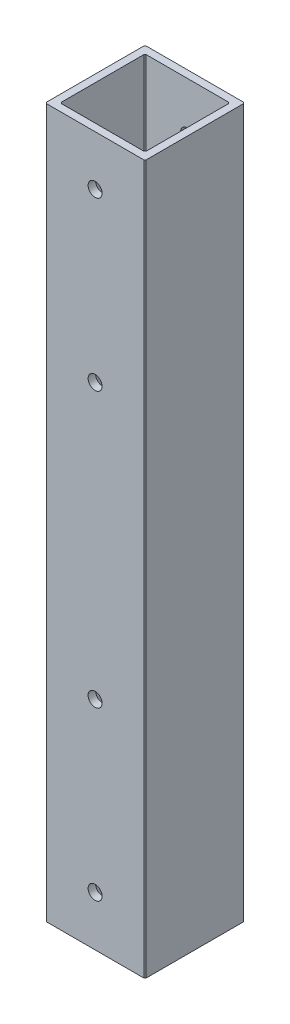
ISO-10303-21;
HEADER;
FILE_DESCRIPTION(('STEP AP214'),'2;1');
FILE_NAME('part.step','',(''),(''),'','','');
FILE_SCHEMA(('AUTOMOTIVE_DESIGN { 1 0 10303 214 1 1 1 1 }'));
ENDSEC;
DATA;
#1=APPLICATION_CONTEXT('core data for automotive mechanical design processes');
#2=APPLICATION_PROTOCOL_DEFINITION('international standard','automotive_design',2000,#1);
#3=PRODUCT_CONTEXT('',#1,'mechanical');
#4=PRODUCT('Part','Part','',(#3));
#5=PRODUCT_RELATED_PRODUCT_CATEGORY('part','',(#4));
#6=PRODUCT_DEFINITION_FORMATION('','',#4);
#7=PRODUCT_DEFINITION_CONTEXT('part definition',#1,'design');
#8=PRODUCT_DEFINITION('design','',#6,#7);
#9=PRODUCT_DEFINITION_SHAPE('','',#8);
#10=(LENGTH_UNIT() NAMED_UNIT(*) SI_UNIT(.MILLI.,.METRE.));
#11=(NAMED_UNIT(*) PLANE_ANGLE_UNIT() SI_UNIT($,.RADIAN.));
#12=(NAMED_UNIT(*) SI_UNIT($,.STERADIAN.) SOLID_ANGLE_UNIT());
#13=UNCERTAINTY_MEASURE_WITH_UNIT(LENGTH_MEASURE(1.E-05),#10,'distance_accuracy_value','');
#14=(GEOMETRIC_REPRESENTATION_CONTEXT(3) GLOBAL_UNCERTAINTY_ASSIGNED_CONTEXT((#13)) GLOBAL_UNIT_ASSIGNED_CONTEXT((#10,
#11,#12)) REPRESENTATION_CONTEXT('',''));
#15=CARTESIAN_POINT('',(0.,0.,0.));
#16=DIRECTION('',(0.,0.,1.));
#17=DIRECTION('',(1.,0.,0.));
#18=AXIS2_PLACEMENT_3D('',#15,#16,#17);
#19=CARTESIAN_POINT('',(-100.,122.,138.));
#20=DIRECTION('',(0.,0.,1.));
#21=DIRECTION('',(1.,0.,0.));
#22=AXIS2_PLACEMENT_3D('',#19,#20,#21);
#23=CYLINDRICAL_SURFACE('',#22,2.8);
#24=DIRECTION('',(0.,0.,1.));
#25=VECTOR('',#24,1.);
#26=CARTESIAN_POINT('',(-97.2,122.,138.));
#27=LINE('',#26,#25);
#28=CARTESIAN_POINT('',(-97.2,122.,177.));
#29=VERTEX_POINT('',#28);
#30=CARTESIAN_POINT('',(-97.2,122.,180.));
#31=VERTEX_POINT('',#30);
#32=EDGE_CURVE('E12',#29,#31,#27,.T.);
#33=ORIENTED_EDGE('',*,*,#32,.F.);
#34=CARTESIAN_POINT('',(-100.,122.,177.));
#35=DIRECTION('',(0.,0.,1.));
#36=DIRECTION('',(1.,0.,0.));
#37=AXIS2_PLACEMENT_3D('',#34,#35,#36);
#38=CIRCLE('',#37,2.8);
#39=EDGE_CURVE('E247',#29,#29,#38,.T.);
#40=ORIENTED_EDGE('',*,*,#39,.F.);
#41=ORIENTED_EDGE('',*,*,#32,.T.);
#42=CARTESIAN_POINT('',(-100.,122.,180.));
#43=DIRECTION('',(0.,0.,1.));
#44=DIRECTION('',(1.,0.,0.));
#45=AXIS2_PLACEMENT_3D('',#42,#43,#44);
#46=CIRCLE('',#45,2.8);
#47=EDGE_CURVE('E473',#31,#31,#46,.T.);
#48=ORIENTED_EDGE('',*,*,#47,.T.);
#49=EDGE_LOOP('',(#33,#40,#41,#48));
#50=FACE_BOUND('',#49,.T.);
#51=ADVANCED_FACE('F20',(#50),#23,.F.);
#52=CARTESIAN_POINT('',(-100.,55.,138.));
#53=DIRECTION('',(0.,0.,1.));
#54=DIRECTION('',(1.,0.,0.));
#55=AXIS2_PLACEMENT_3D('',#52,#53,#54);
#56=CYLINDRICAL_SURFACE('',#55,2.8);
#57=DIRECTION('',(0.,0.,1.));
#58=VECTOR('',#57,1.);
#59=CARTESIAN_POINT('',(-97.2,55.,138.));
#60=LINE('',#59,#58);
#61=CARTESIAN_POINT('',(-97.2,55.,177.));
#62=VERTEX_POINT('',#61);
#63=CARTESIAN_POINT('',(-97.2,55.,180.));
#64=VERTEX_POINT('',#63);
#65=EDGE_CURVE('E29',#62,#64,#60,.T.);
#66=ORIENTED_EDGE('',*,*,#65,.F.);
#67=CARTESIAN_POINT('',(-100.,55.,177.));
#68=DIRECTION('',(0.,0.,1.));
#69=DIRECTION('',(1.,0.,0.));
#70=AXIS2_PLACEMENT_3D('',#67,#68,#69);
#71=CIRCLE('',#70,2.8);
#72=EDGE_CURVE('E239',#62,#62,#71,.T.);
#73=ORIENTED_EDGE('',*,*,#72,.F.);
#74=ORIENTED_EDGE('',*,*,#65,.T.);
#75=CARTESIAN_POINT('',(-100.,55.,180.));
#76=DIRECTION('',(0.,0.,1.));
#77=DIRECTION('',(1.,0.,0.));
#78=AXIS2_PLACEMENT_3D('',#75,#76,#77);
#79=CIRCLE('',#78,2.8);
#80=EDGE_CURVE('E299',#64,#64,#79,.T.);
#81=ORIENTED_EDGE('',*,*,#80,.T.);
#82=EDGE_LOOP('',(#66,#73,#74,#81));
#83=FACE_BOUND('',#82,.T.);
#84=ADVANCED_FACE('F297',(#83),#56,.F.);
#85=CARTESIAN_POINT('',(-100.,-55.,138.));
#86=DIRECTION('',(0.,0.,1.));
#87=DIRECTION('',(1.,0.,0.));
#88=AXIS2_PLACEMENT_3D('',#85,#86,#87);
#89=CYLINDRICAL_SURFACE('',#88,2.8);
#90=DIRECTION('',(0.,0.,1.));
#91=VECTOR('',#90,1.);
#92=CARTESIAN_POINT('',(-97.2,-55.,138.));
#93=LINE('',#92,#91);
#94=CARTESIAN_POINT('',(-97.2,-55.,177.));
#95=VERTEX_POINT('',#94);
#96=CARTESIAN_POINT('',(-97.2,-55.,180.));
#97=VERTEX_POINT('',#96);
#98=EDGE_CURVE('E226',#95,#97,#93,.T.);
#99=ORIENTED_EDGE('',*,*,#98,.F.);
#100=CARTESIAN_POINT('',(-100.,-55.,177.));
#101=DIRECTION('',(0.,0.,1.));
#102=DIRECTION('',(1.,0.,0.));
#103=AXIS2_PLACEMENT_3D('',#100,#101,#102);
#104=CIRCLE('',#103,2.8);
#105=EDGE_CURVE('E229',#95,#95,#104,.T.);
#106=ORIENTED_EDGE('',*,*,#105,.F.);
#107=ORIENTED_EDGE('',*,*,#98,.T.);
#108=CARTESIAN_POINT('',(-100.,-55.,180.));
#109=DIRECTION('',(0.,0.,1.));
#110=DIRECTION('',(1.,0.,0.));
#111=AXIS2_PLACEMENT_3D('',#108,#109,#110);
#112=CIRCLE('',#111,2.8);
#113=EDGE_CURVE('E231',#97,#97,#112,.T.);
#114=ORIENTED_EDGE('',*,*,#113,.T.);
#115=EDGE_LOOP('',(#99,#106,#107,#114));
#116=FACE_BOUND('',#115,.T.);
#117=ADVANCED_FACE('F228',(#116),#89,.F.);
#118=CARTESIAN_POINT('',(-100.,-122.,138.));
#119=DIRECTION('',(0.,0.,1.));
#120=DIRECTION('',(1.,0.,0.));
#121=AXIS2_PLACEMENT_3D('',#118,#119,#120);
#122=CYLINDRICAL_SURFACE('',#121,2.8);
#123=DIRECTION('',(0.,0.,1.));
#124=VECTOR('',#123,1.);
#125=CARTESIAN_POINT('',(-97.2,-122.,138.));
#126=LINE('',#125,#124);
#127=CARTESIAN_POINT('',(-97.2,-122.,177.));
#128=VERTEX_POINT('',#127);
#129=CARTESIAN_POINT('',(-97.2,-122.,180.));
#130=VERTEX_POINT('',#129);
#131=EDGE_CURVE('E233',#128,#130,#126,.T.);
#132=ORIENTED_EDGE('',*,*,#131,.F.);
#133=CARTESIAN_POINT('',(-100.,-122.,177.));
#134=DIRECTION('',(0.,0.,1.));
#135=DIRECTION('',(1.,0.,0.));
#136=AXIS2_PLACEMENT_3D('',#133,#134,#135);
#137=CIRCLE('',#136,2.8);
#138=EDGE_CURVE('E240',#128,#128,#137,.T.);
#139=ORIENTED_EDGE('',*,*,#138,.F.);
#140=ORIENTED_EDGE('',*,*,#131,.T.);
#141=CARTESIAN_POINT('',(-100.,-122.,180.));
#142=DIRECTION('',(0.,0.,1.));
#143=DIRECTION('',(1.,0.,0.));
#144=AXIS2_PLACEMENT_3D('',#141,#142,#143);
#145=CIRCLE('',#144,2.8);
#146=EDGE_CURVE('E408',#130,#130,#145,.T.);
#147=ORIENTED_EDGE('',*,*,#146,.T.);
#148=EDGE_LOOP('',(#132,#139,#140,#147));
#149=FACE_BOUND('',#148,.T.);
#150=ADVANCED_FACE('F325',(#149),#122,.F.);
#151=CARTESIAN_POINT('',(-100.,122.,138.));
#152=DIRECTION('',(0.,0.,1.));
#153=DIRECTION('',(1.,0.,0.));
#154=AXIS2_PLACEMENT_3D('',#151,#152,#153);
#155=CYLINDRICAL_SURFACE('',#154,2.8);
#156=DIRECTION('',(0.,0.,1.));
#157=VECTOR('',#156,1.);
#158=CARTESIAN_POINT('',(-97.2,122.,138.));
#159=LINE('',#158,#157);
#160=CARTESIAN_POINT('',(-97.2,122.,140.));
#161=VERTEX_POINT('',#160);
#162=CARTESIAN_POINT('',(-97.2,122.,143.));
#163=VERTEX_POINT('',#162);
#164=EDGE_CURVE('E355',#161,#163,#159,.T.);
#165=ORIENTED_EDGE('',*,*,#164,.F.);
#166=CARTESIAN_POINT('',(-100.,122.,140.));
#167=DIRECTION('',(0.,0.,1.));
#168=DIRECTION('',(1.,0.,0.));
#169=AXIS2_PLACEMENT_3D('',#166,#167,#168);
#170=CIRCLE('',#169,2.8);
#171=EDGE_CURVE('E362',#161,#161,#170,.T.);
#172=ORIENTED_EDGE('',*,*,#171,.F.);
#173=ORIENTED_EDGE('',*,*,#164,.T.);
#174=CARTESIAN_POINT('',(-100.,122.,143.));
#175=DIRECTION('',(0.,0.,1.));
#176=DIRECTION('',(1.,0.,0.));
#177=AXIS2_PLACEMENT_3D('',#174,#175,#176);
#178=CIRCLE('',#177,2.8);
#179=EDGE_CURVE('E582',#163,#163,#178,.T.);
#180=ORIENTED_EDGE('',*,*,#179,.T.);
#181=EDGE_LOOP('',(#165,#172,#173,#180));
#182=FACE_BOUND('',#181,.T.);
#183=ADVANCED_FACE('F330',(#182),#155,.F.);
#184=CARTESIAN_POINT('',(-100.,55.,138.));
#185=DIRECTION('',(0.,0.,1.));
#186=DIRECTION('',(1.,0.,0.));
#187=AXIS2_PLACEMENT_3D('',#184,#185,#186);
#188=CYLINDRICAL_SURFACE('',#187,2.8);
#189=DIRECTION('',(0.,0.,1.));
#190=VECTOR('',#189,1.);
#191=CARTESIAN_POINT('',(-97.2,55.,138.));
#192=LINE('',#191,#190);
#193=CARTESIAN_POINT('',(-97.2,55.,140.));
#194=VERTEX_POINT('',#193);
#195=CARTESIAN_POINT('',(-97.2,55.,143.));
#196=VERTEX_POINT('',#195);
#197=EDGE_CURVE('E349',#194,#196,#192,.T.);
#198=ORIENTED_EDGE('',*,*,#197,.F.);
#199=CARTESIAN_POINT('',(-100.,55.,140.));
#200=DIRECTION('',(0.,0.,1.));
#201=DIRECTION('',(1.,0.,0.));
#202=AXIS2_PLACEMENT_3D('',#199,#200,#201);
#203=CIRCLE('',#202,2.8);
#204=EDGE_CURVE('E351',#194,#194,#203,.T.);
#205=ORIENTED_EDGE('',*,*,#204,.F.);
#206=ORIENTED_EDGE('',*,*,#197,.T.);
#207=CARTESIAN_POINT('',(-100.,55.,143.));
#208=DIRECTION('',(0.,0.,1.));
#209=DIRECTION('',(1.,0.,0.));
#210=AXIS2_PLACEMENT_3D('',#207,#208,#209);
#211=CIRCLE('',#210,2.8);
#212=EDGE_CURVE('E353',#196,#196,#211,.T.);
#213=ORIENTED_EDGE('',*,*,#212,.T.);
#214=EDGE_LOOP('',(#198,#205,#206,#213));
#215=FACE_BOUND('',#214,.T.);
#216=ADVANCED_FACE('F334',(#215),#188,.F.);
#217=CARTESIAN_POINT('',(-100.,-55.,138.));
#218=DIRECTION('',(0.,0.,1.));
#219=DIRECTION('',(1.,0.,0.));
#220=AXIS2_PLACEMENT_3D('',#217,#218,#219);
#221=CYLINDRICAL_SURFACE('',#220,2.8);
#222=DIRECTION('',(0.,0.,1.));
#223=VECTOR('',#222,1.);
#224=CARTESIAN_POINT('',(-97.2,-55.,138.));
#225=LINE('',#224,#223);
#226=CARTESIAN_POINT('',(-97.2,-55.,140.));
#227=VERTEX_POINT('',#226);
#228=CARTESIAN_POINT('',(-97.2,-55.,143.));
#229=VERTEX_POINT('',#228);
#230=EDGE_CURVE('E356',#227,#229,#225,.T.);
#231=ORIENTED_EDGE('',*,*,#230,.F.);
#232=CARTESIAN_POINT('',(-100.,-55.,140.));
#233=DIRECTION('',(0.,0.,1.));
#234=DIRECTION('',(1.,0.,0.));
#235=AXIS2_PLACEMENT_3D('',#232,#233,#234);
#236=CIRCLE('',#235,2.8);
#237=EDGE_CURVE('E363',#227,#227,#236,.T.);
#238=ORIENTED_EDGE('',*,*,#237,.F.);
#239=ORIENTED_EDGE('',*,*,#230,.T.);
#240=CARTESIAN_POINT('',(-100.,-55.,143.));
#241=DIRECTION('',(0.,0.,1.));
#242=DIRECTION('',(1.,0.,0.));
#243=AXIS2_PLACEMENT_3D('',#240,#241,#242);
#244=CIRCLE('',#243,2.8);
#245=EDGE_CURVE('E257',#229,#229,#244,.T.);
#246=ORIENTED_EDGE('',*,*,#245,.T.);
#247=EDGE_LOOP('',(#231,#238,#239,#246));
#248=FACE_BOUND('',#247,.T.);
#249=ADVANCED_FACE('F336',(#248),#221,.F.);
#250=CARTESIAN_POINT('',(-100.,-122.,138.));
#251=DIRECTION('',(0.,0.,1.));
#252=DIRECTION('',(1.,0.,0.));
#253=AXIS2_PLACEMENT_3D('',#250,#251,#252);
#254=CYLINDRICAL_SURFACE('',#253,2.8);
#255=DIRECTION('',(0.,0.,1.));
#256=VECTOR('',#255,1.);
#257=CARTESIAN_POINT('',(-97.2,-122.,138.));
#258=LINE('',#257,#256);
#259=CARTESIAN_POINT('',(-97.2,-122.,140.));
#260=VERTEX_POINT('',#259);
#261=CARTESIAN_POINT('',(-97.2,-122.,143.));
#262=VERTEX_POINT('',#261);
#263=EDGE_CURVE('E290',#260,#262,#258,.T.);
#264=ORIENTED_EDGE('',*,*,#263,.F.);
#265=CARTESIAN_POINT('',(-100.,-122.,140.));
#266=DIRECTION('',(0.,0.,1.));
#267=DIRECTION('',(1.,0.,0.));
#268=AXIS2_PLACEMENT_3D('',#265,#266,#267);
#269=CIRCLE('',#268,2.8);
#270=EDGE_CURVE('E372',#260,#260,#269,.T.);
#271=ORIENTED_EDGE('',*,*,#270,.F.);
#272=ORIENTED_EDGE('',*,*,#263,.T.);
#273=CARTESIAN_POINT('',(-100.,-122.,143.));
#274=DIRECTION('',(0.,0.,1.));
#275=DIRECTION('',(1.,0.,0.));
#276=AXIS2_PLACEMENT_3D('',#273,#274,#275);
#277=CIRCLE('',#276,2.8);
#278=EDGE_CURVE('E389',#262,#262,#277,.T.);
#279=ORIENTED_EDGE('',*,*,#278,.T.);
#280=EDGE_LOOP('',(#264,#271,#272,#279));
#281=FACE_BOUND('',#280,.T.);
#282=ADVANCED_FACE('F314',(#281),#254,.F.);
#283=CARTESIAN_POINT('',(-80.,142.,140.));
#284=DIRECTION('',(0.,1.,0.));
#285=DIRECTION('',(1.,0.,0.));
#286=AXIS2_PLACEMENT_3D('',#283,#284,#285);
#287=PLANE('',#286);
#288=DIRECTION('',(1.,0.,0.));
#289=VECTOR('',#288,1.);
#290=CARTESIAN_POINT('',(-81.5,142.,143.));
#291=LINE('',#290,#289);
#292=CARTESIAN_POINT('',(-116.5,142.,143.));
#293=VERTEX_POINT('',#292);
#294=CARTESIAN_POINT('',(-83.5,142.,143.));
#295=VERTEX_POINT('',#294);
#296=EDGE_CURVE('E507',#293,#295,#291,.T.);
#297=ORIENTED_EDGE('',*,*,#296,.T.);
#298=DIRECTION('',(0.707106781186548,0.,0.707106781186548));
#299=VECTOR('',#298,1.);
#300=CARTESIAN_POINT('',(-83.25,142.,143.25));
#301=LINE('',#300,#299);
#302=CARTESIAN_POINT('',(-83.,142.,143.5));
#303=VERTEX_POINT('',#302);
#304=EDGE_CURVE('E270',#295,#303,#301,.T.);
#305=ORIENTED_EDGE('',*,*,#304,.T.);
#306=DIRECTION('',(0.,0.,1.));
#307=VECTOR('',#306,1.);
#308=CARTESIAN_POINT('',(-83.,142.,141.5));
#309=LINE('',#308,#307);
#310=CARTESIAN_POINT('',(-83.,142.,176.5));
#311=VERTEX_POINT('',#310);
#312=EDGE_CURVE('E416',#303,#311,#309,.T.);
#313=ORIENTED_EDGE('',*,*,#312,.T.);
#314=DIRECTION('',(0.707106781186548,0.,-0.707106781186548));
#315=VECTOR('',#314,1.);
#316=CARTESIAN_POINT('',(-73.25,142.,166.75));
#317=LINE('',#316,#315);
#318=CARTESIAN_POINT('',(-83.5,142.,177.));
#319=VERTEX_POINT('',#318);
#320=EDGE_CURVE('E283',#319,#311,#317,.T.);
#321=ORIENTED_EDGE('',*,*,#320,.F.);
#322=DIRECTION('',(1.,0.,0.));
#323=VECTOR('',#322,1.);
#324=CARTESIAN_POINT('',(-81.5,142.,177.));
#325=LINE('',#324,#323);
#326=CARTESIAN_POINT('',(-116.5,142.,177.));
#327=VERTEX_POINT('',#326);
#328=EDGE_CURVE('E250',#327,#319,#325,.T.);
#329=ORIENTED_EDGE('',*,*,#328,.F.);
#330=DIRECTION('',(0.707106781186548,0.,0.707106781186548));
#331=VECTOR('',#330,1.);
#332=CARTESIAN_POINT('',(-116.75,142.,176.75));
#333=LINE('',#332,#331);
#334=CARTESIAN_POINT('',(-117.,142.,176.5));
#335=VERTEX_POINT('',#334);
#336=EDGE_CURVE('E272',#335,#327,#333,.T.);
#337=ORIENTED_EDGE('',*,*,#336,.F.);
#338=DIRECTION('',(0.,0.,1.));
#339=VECTOR('',#338,1.);
#340=CARTESIAN_POINT('',(-117.,142.,141.5));
#341=LINE('',#340,#339);
#342=CARTESIAN_POINT('',(-117.,142.,143.5));
#343=VERTEX_POINT('',#342);
#344=EDGE_CURVE('E421',#343,#335,#341,.T.);
#345=ORIENTED_EDGE('',*,*,#344,.F.);
#346=DIRECTION('',(-0.707106781186548,0.,0.707106781186548));
#347=VECTOR('',#346,1.);
#348=CARTESIAN_POINT('',(-106.75,142.,133.25));
#349=LINE('',#348,#347);
#350=EDGE_CURVE('E504',#293,#343,#349,.T.);
#351=ORIENTED_EDGE('',*,*,#350,.F.);
#352=EDGE_LOOP('',(#297,#305,#313,#321,#329,#337,#345,#351));
#353=FACE_BOUND('',#352,.T.);
#354=DIRECTION('',(0.,0.,1.));
#355=VECTOR('',#354,1.);
#356=CARTESIAN_POINT('',(-80.,142.,140.));
#357=LINE('',#356,#355);
#358=CARTESIAN_POINT('',(-80.,142.,140.5));
#359=VERTEX_POINT('',#358);
#360=CARTESIAN_POINT('',(-80.,142.,179.5));
#361=VERTEX_POINT('',#360);
#362=EDGE_CURVE('E442',#359,#361,#357,.T.);
#363=ORIENTED_EDGE('',*,*,#362,.F.);
#364=DIRECTION('',(-0.707106781186548,0.,-0.707106781186548));
#365=VECTOR('',#364,1.);
#366=CARTESIAN_POINT('',(-80.25,142.,140.25));
#367=LINE('',#366,#365);
#368=CARTESIAN_POINT('',(-80.5,142.,140.));
#369=VERTEX_POINT('',#368);
#370=EDGE_CURVE('E452',#359,#369,#367,.T.);
#371=ORIENTED_EDGE('',*,*,#370,.T.);
#372=DIRECTION('',(-1.,0.,0.));
#373=VECTOR('',#372,1.);
#374=CARTESIAN_POINT('',(-80.,142.,140.));
#375=LINE('',#374,#373);
#376=CARTESIAN_POINT('',(-119.5,142.,140.));
#377=VERTEX_POINT('',#376);
#378=EDGE_CURVE('E402',#369,#377,#375,.T.);
#379=ORIENTED_EDGE('',*,*,#378,.T.);
#380=DIRECTION('',(-0.707106781186548,0.,0.707106781186548));
#381=VECTOR('',#380,1.);
#382=CARTESIAN_POINT('',(-109.75,142.,130.25));
#383=LINE('',#382,#381);
#384=CARTESIAN_POINT('',(-120.,142.,140.5));
#385=VERTEX_POINT('',#384);
#386=EDGE_CURVE('E481',#377,#385,#383,.T.);
#387=ORIENTED_EDGE('',*,*,#386,.T.);
#388=DIRECTION('',(0.,0.,1.));
#389=VECTOR('',#388,1.);
#390=CARTESIAN_POINT('',(-120.,142.,140.));
#391=LINE('',#390,#389);
#392=CARTESIAN_POINT('',(-120.,142.,179.5));
#393=VERTEX_POINT('',#392);
#394=EDGE_CURVE('E498',#385,#393,#391,.T.);
#395=ORIENTED_EDGE('',*,*,#394,.T.);
#396=DIRECTION('',(-0.707106781186548,0.,-0.707106781186548));
#397=VECTOR('',#396,1.);
#398=CARTESIAN_POINT('',(-119.75,142.,179.75));
#399=LINE('',#398,#397);
#400=CARTESIAN_POINT('',(-119.5,142.,180.));
#401=VERTEX_POINT('',#400);
#402=EDGE_CURVE('E485',#401,#393,#399,.T.);
#403=ORIENTED_EDGE('',*,*,#402,.F.);
#404=DIRECTION('',(-1.,0.,0.));
#405=VECTOR('',#404,1.);
#406=CARTESIAN_POINT('',(-80.,142.,180.));
#407=LINE('',#406,#405);
#408=CARTESIAN_POINT('',(-80.5,142.,180.));
#409=VERTEX_POINT('',#408);
#410=EDGE_CURVE('E369',#409,#401,#407,.T.);
#411=ORIENTED_EDGE('',*,*,#410,.F.);
#412=DIRECTION('',(-0.707106781186548,0.,0.707106781186548));
#413=VECTOR('',#412,1.);
#414=CARTESIAN_POINT('',(-70.25,142.,169.75));
#415=LINE('',#414,#413);
#416=EDGE_CURVE('E397',#361,#409,#415,.T.);
#417=ORIENTED_EDGE('',*,*,#416,.F.);
#418=EDGE_LOOP('',(#363,#371,#379,#387,#395,#403,#411,#417));
#419=FACE_BOUND('',#418,.T.);
#420=ADVANCED_FACE('F303',(#353,#419),#287,.T.);
#421=CARTESIAN_POINT('',(-83.,-143.,177.));
#422=DIRECTION('',(0.,0.,1.));
#423=DIRECTION('',(1.,0.,0.));
#424=AXIS2_PLACEMENT_3D('',#421,#422,#423);
#425=PLANE('',#424);
#426=ORIENTED_EDGE('',*,*,#39,.T.);
#427=EDGE_LOOP('',(#426));
#428=FACE_BOUND('',#427,.T.);
#429=ORIENTED_EDGE('',*,*,#72,.T.);
#430=EDGE_LOOP('',(#429));
#431=FACE_BOUND('',#430,.T.);
#432=ORIENTED_EDGE('',*,*,#105,.T.);
#433=EDGE_LOOP('',(#432));
#434=FACE_BOUND('',#433,.T.);
#435=ORIENTED_EDGE('',*,*,#138,.T.);
#436=EDGE_LOOP('',(#435));
#437=FACE_BOUND('',#436,.T.);
#438=DIRECTION('',(0.,1.,0.));
#439=VECTOR('',#438,1.);
#440=CARTESIAN_POINT('',(-83.5,-142.,177.));
#441=LINE('',#440,#439);
#442=CARTESIAN_POINT('',(-83.5,-142.,177.));
#443=VERTEX_POINT('',#442);
#444=EDGE_CURVE('E278',#443,#319,#441,.T.);
#445=ORIENTED_EDGE('',*,*,#444,.F.);
#446=DIRECTION('',(1.,0.,0.));
#447=VECTOR('',#446,1.);
#448=CARTESIAN_POINT('',(-81.5,-142.,177.));
#449=LINE('',#448,#447);
#450=CARTESIAN_POINT('',(-116.5,-142.,177.));
#451=VERTEX_POINT('',#450);
#452=EDGE_CURVE('E534',#451,#443,#449,.T.);
#453=ORIENTED_EDGE('',*,*,#452,.F.);
#454=DIRECTION('',(0.,1.,0.));
#455=VECTOR('',#454,1.);
#456=CARTESIAN_POINT('',(-116.5,-142.,177.));
#457=LINE('',#456,#455);
#458=EDGE_CURVE('E276',#451,#327,#457,.T.);
#459=ORIENTED_EDGE('',*,*,#458,.T.);
#460=ORIENTED_EDGE('',*,*,#328,.T.);
#461=EDGE_LOOP('',(#445,#453,#459,#460));
#462=FACE_BOUND('',#461,.T.);
#463=ADVANCED_FACE('F236',(#428,#431,#434,#437,#462),#425,.F.);
#464=CARTESIAN_POINT('',(-83.25,-142.,176.75));
#465=DIRECTION('',(-0.707106781186548,0.,-0.707106781186548));
#466=DIRECTION('',(-0.707106781186548,0.,0.707106781186548));
#467=AXIS2_PLACEMENT_3D('',#464,#465,#466);
#468=PLANE('',#467);
#469=DIRECTION('',(0.707106781186548,0.,-0.707106781186548));
#470=VECTOR('',#469,1.);
#471=CARTESIAN_POINT('',(-73.25,-142.,166.75));
#472=LINE('',#471,#470);
#473=CARTESIAN_POINT('',(-83.,-142.,176.5));
#474=VERTEX_POINT('',#473);
#475=EDGE_CURVE('E526',#443,#474,#472,.T.);
#476=ORIENTED_EDGE('',*,*,#475,.F.);
#477=ORIENTED_EDGE('',*,*,#444,.T.);
#478=ORIENTED_EDGE('',*,*,#320,.T.);
#479=DIRECTION('',(0.,1.,0.));
#480=VECTOR('',#479,1.);
#481=CARTESIAN_POINT('',(-83.,-142.,176.5));
#482=LINE('',#481,#480);
#483=EDGE_CURVE('E277',#474,#311,#482,.T.);
#484=ORIENTED_EDGE('',*,*,#483,.F.);
#485=EDGE_LOOP('',(#476,#477,#478,#484));
#486=FACE_BOUND('',#485,.T.);
#487=ADVANCED_FACE('F302',(#486),#468,.T.);
#488=CARTESIAN_POINT('',(-116.75,-142.,176.75));
#489=DIRECTION('',(-0.707106781186548,0.,0.707106781186548));
#490=DIRECTION('',(0.,1.,0.));
#491=AXIS2_PLACEMENT_3D('',#488,#489,#490);
#492=PLANE('',#491);
#493=DIRECTION('',(0.707106781186548,0.,0.707106781186548));
#494=VECTOR('',#493,1.);
#495=CARTESIAN_POINT('',(-116.75,-142.,176.75));
#496=LINE('',#495,#494);
#497=CARTESIAN_POINT('',(-117.,-142.,176.5));
#498=VERTEX_POINT('',#497);
#499=EDGE_CURVE('E563',#498,#451,#496,.T.);
#500=ORIENTED_EDGE('',*,*,#499,.F.);
#501=DIRECTION('',(0.,1.,0.));
#502=VECTOR('',#501,1.);
#503=CARTESIAN_POINT('',(-117.,-142.,176.5));
#504=LINE('',#503,#502);
#505=EDGE_CURVE('E431',#498,#335,#504,.T.);
#506=ORIENTED_EDGE('',*,*,#505,.T.);
#507=ORIENTED_EDGE('',*,*,#336,.T.);
#508=ORIENTED_EDGE('',*,*,#458,.F.);
#509=EDGE_LOOP('',(#500,#506,#507,#508));
#510=FACE_BOUND('',#509,.T.);
#511=ADVANCED_FACE('F311',(#510),#492,.F.);
#512=CARTESIAN_POINT('',(-83.,-143.,143.));
#513=DIRECTION('',(-1.,0.,0.));
#514=DIRECTION('',(0.,0.,1.));
#515=AXIS2_PLACEMENT_3D('',#512,#513,#514);
#516=PLANE('',#515);
#517=ORIENTED_EDGE('',*,*,#312,.F.);
#518=DIRECTION('',(0.,1.,0.));
#519=VECTOR('',#518,1.);
#520=CARTESIAN_POINT('',(-83.,-142.,143.5));
#521=LINE('',#520,#519);
#522=CARTESIAN_POINT('',(-83.,-142.,143.5));
#523=VERTEX_POINT('',#522);
#524=EDGE_CURVE('E503',#523,#303,#521,.T.);
#525=ORIENTED_EDGE('',*,*,#524,.F.);
#526=DIRECTION('',(0.,0.,1.));
#527=VECTOR('',#526,1.);
#528=CARTESIAN_POINT('',(-83.,-142.,141.5));
#529=LINE('',#528,#527);
#530=EDGE_CURVE('E521',#523,#474,#529,.T.);
#531=ORIENTED_EDGE('',*,*,#530,.T.);
#532=ORIENTED_EDGE('',*,*,#483,.T.);
#533=EDGE_LOOP('',(#517,#525,#531,#532));
#534=FACE_BOUND('',#533,.T.);
#535=ADVANCED_FACE('F741',(#534),#516,.T.);
#536=CARTESIAN_POINT('',(-117.,-143.,143.));
#537=DIRECTION('',(-1.,0.,0.));
#538=DIRECTION('',(0.,0.,1.));
#539=AXIS2_PLACEMENT_3D('',#536,#537,#538);
#540=PLANE('',#539);
#541=ORIENTED_EDGE('',*,*,#505,.F.);
#542=DIRECTION('',(0.,0.,1.));
#543=VECTOR('',#542,1.);
#544=CARTESIAN_POINT('',(-117.,-142.,141.5));
#545=LINE('',#544,#543);
#546=CARTESIAN_POINT('',(-117.,-142.,143.5));
#547=VERTEX_POINT('',#546);
#548=EDGE_CURVE('E568',#547,#498,#545,.T.);
#549=ORIENTED_EDGE('',*,*,#548,.F.);
#550=DIRECTION('',(0.,1.,0.));
#551=VECTOR('',#550,1.);
#552=CARTESIAN_POINT('',(-117.,-142.,143.5));
#553=LINE('',#552,#551);
#554=EDGE_CURVE('E499',#547,#343,#553,.T.);
#555=ORIENTED_EDGE('',*,*,#554,.T.);
#556=ORIENTED_EDGE('',*,*,#344,.T.);
#557=EDGE_LOOP('',(#541,#549,#555,#556));
#558=FACE_BOUND('',#557,.T.);
#559=ADVANCED_FACE('F729',(#558),#540,.F.);
#560=CARTESIAN_POINT('',(-83.25,-142.,143.25));
#561=DIRECTION('',(0.707106781186548,0.,-0.707106781186548));
#562=DIRECTION('',(0.,-1.,0.));
#563=AXIS2_PLACEMENT_3D('',#560,#561,#562);
#564=PLANE('',#563);
#565=ORIENTED_EDGE('',*,*,#524,.T.);
#566=ORIENTED_EDGE('',*,*,#304,.F.);
#567=DIRECTION('',(0.,1.,0.));
#568=VECTOR('',#567,1.);
#569=CARTESIAN_POINT('',(-83.5,-142.,143.));
#570=LINE('',#569,#568);
#571=CARTESIAN_POINT('',(-83.5,-142.,143.));
#572=VERTEX_POINT('',#571);
#573=EDGE_CURVE('E629',#572,#295,#570,.T.);
#574=ORIENTED_EDGE('',*,*,#573,.F.);
#575=DIRECTION('',(0.707106781186548,0.,0.707106781186548));
#576=VECTOR('',#575,1.);
#577=CARTESIAN_POINT('',(-83.25,-142.,143.25));
#578=LINE('',#577,#576);
#579=EDGE_CURVE('E525',#572,#523,#578,.T.);
#580=ORIENTED_EDGE('',*,*,#579,.T.);
#581=EDGE_LOOP('',(#565,#566,#574,#580));
#582=FACE_BOUND('',#581,.T.);
#583=ADVANCED_FACE('F743',(#582),#564,.F.);
#584=CARTESIAN_POINT('',(-116.75,-142.,143.25));
#585=DIRECTION('',(0.707106781186548,0.,0.707106781186548));
#586=DIRECTION('',(0.,-1.,0.));
#587=AXIS2_PLACEMENT_3D('',#584,#585,#586);
#588=PLANE('',#587);
#589=DIRECTION('',(-0.707106781186548,0.,0.707106781186548));
#590=VECTOR('',#589,1.);
#591=CARTESIAN_POINT('',(-106.75,-142.,133.25));
#592=LINE('',#591,#590);
#593=CARTESIAN_POINT('',(-116.5,-142.,143.));
#594=VERTEX_POINT('',#593);
#595=EDGE_CURVE('E465',#594,#547,#592,.T.);
#596=ORIENTED_EDGE('',*,*,#595,.F.);
#597=DIRECTION('',(0.,1.,0.));
#598=VECTOR('',#597,1.);
#599=CARTESIAN_POINT('',(-116.5,-142.,143.));
#600=LINE('',#599,#598);
#601=EDGE_CURVE('E255',#594,#293,#600,.T.);
#602=ORIENTED_EDGE('',*,*,#601,.T.);
#603=ORIENTED_EDGE('',*,*,#350,.T.);
#604=ORIENTED_EDGE('',*,*,#554,.F.);
#605=EDGE_LOOP('',(#596,#602,#603,#604));
#606=FACE_BOUND('',#605,.T.);
#607=ADVANCED_FACE('F726',(#606),#588,.T.);
#608=CARTESIAN_POINT('',(-83.,-143.,143.));
#609=DIRECTION('',(0.,0.,1.));
#610=DIRECTION('',(1.,0.,0.));
#611=AXIS2_PLACEMENT_3D('',#608,#609,#610);
#612=PLANE('',#611);
#613=ORIENTED_EDGE('',*,*,#179,.F.);
#614=EDGE_LOOP('',(#613));
#615=FACE_BOUND('',#614,.T.);
#616=ORIENTED_EDGE('',*,*,#212,.F.);
#617=EDGE_LOOP('',(#616));
#618=FACE_BOUND('',#617,.T.);
#619=ORIENTED_EDGE('',*,*,#245,.F.);
#620=EDGE_LOOP('',(#619));
#621=FACE_BOUND('',#620,.T.);
#622=ORIENTED_EDGE('',*,*,#278,.F.);
#623=EDGE_LOOP('',(#622));
#624=FACE_BOUND('',#623,.T.);
#625=ORIENTED_EDGE('',*,*,#296,.F.);
#626=ORIENTED_EDGE('',*,*,#601,.F.);
#627=DIRECTION('',(1.,0.,0.));
#628=VECTOR('',#627,1.);
#629=CARTESIAN_POINT('',(-81.5,-142.,143.));
#630=LINE('',#629,#628);
#631=EDGE_CURVE('E572',#594,#572,#630,.T.);
#632=ORIENTED_EDGE('',*,*,#631,.T.);
#633=ORIENTED_EDGE('',*,*,#573,.T.);
#634=EDGE_LOOP('',(#625,#626,#632,#633));
#635=FACE_BOUND('',#634,.T.);
#636=ADVANCED_FACE('F747',(#615,#618,#621,#624,#635),#612,.T.);
#637=CARTESIAN_POINT('',(-120.,-142.,140.));
#638=DIRECTION('',(-1.,0.,0.));
#639=DIRECTION('',(0.,0.,1.));
#640=AXIS2_PLACEMENT_3D('',#637,#638,#639);
#641=PLANE('',#640);
#642=ORIENTED_EDGE('',*,*,#394,.F.);
#643=DIRECTION('',(0.,1.,0.));
#644=VECTOR('',#643,1.);
#645=CARTESIAN_POINT('',(-120.,-142.,140.5));
#646=LINE('',#645,#644);
#647=CARTESIAN_POINT('',(-120.,-142.,140.5));
#648=VERTEX_POINT('',#647);
#649=EDGE_CURVE('E476',#648,#385,#646,.T.);
#650=ORIENTED_EDGE('',*,*,#649,.F.);
#651=DIRECTION('',(0.,0.,1.));
#652=VECTOR('',#651,1.);
#653=CARTESIAN_POINT('',(-120.,-142.,140.));
#654=LINE('',#653,#652);
#655=CARTESIAN_POINT('',(-120.,-142.,179.5));
#656=VERTEX_POINT('',#655);
#657=EDGE_CURVE('E516',#648,#656,#654,.T.);
#658=ORIENTED_EDGE('',*,*,#657,.T.);
#659=DIRECTION('',(0.,1.,0.));
#660=VECTOR('',#659,1.);
#661=CARTESIAN_POINT('',(-120.,-142.,179.5));
#662=LINE('',#661,#660);
#663=EDGE_CURVE('E491',#656,#393,#662,.T.);
#664=ORIENTED_EDGE('',*,*,#663,.T.);
#665=EDGE_LOOP('',(#642,#650,#658,#664));
#666=FACE_BOUND('',#665,.T.);
#667=ADVANCED_FACE('F607',(#666),#641,.T.);
#668=CARTESIAN_POINT('',(-119.75,-142.,179.75));
#669=DIRECTION('',(-0.707106781186548,0.,0.707106781186548));
#670=DIRECTION('',(0.,1.,0.));
#671=AXIS2_PLACEMENT_3D('',#668,#669,#670);
#672=PLANE('',#671);
#673=DIRECTION('',(-0.707106781186548,0.,-0.707106781186548));
#674=VECTOR('',#673,1.);
#675=CARTESIAN_POINT('',(-119.75,-142.,179.75));
#676=LINE('',#675,#674);
#677=CARTESIAN_POINT('',(-119.5,-142.,180.));
#678=VERTEX_POINT('',#677);
#679=EDGE_CURVE('E464',#678,#656,#676,.T.);
#680=ORIENTED_EDGE('',*,*,#679,.F.);
#681=DIRECTION('',(0.,1.,0.));
#682=VECTOR('',#681,1.);
#683=CARTESIAN_POINT('',(-119.5,-142.,180.));
#684=LINE('',#683,#682);
#685=EDGE_CURVE('E412',#678,#401,#684,.T.);
#686=ORIENTED_EDGE('',*,*,#685,.T.);
#687=ORIENTED_EDGE('',*,*,#402,.T.);
#688=ORIENTED_EDGE('',*,*,#663,.F.);
#689=EDGE_LOOP('',(#680,#686,#687,#688));
#690=FACE_BOUND('',#689,.T.);
#691=ADVANCED_FACE('F611',(#690),#672,.T.);
#692=CARTESIAN_POINT('',(-119.75,-142.,140.25));
#693=DIRECTION('',(0.707106781186548,0.,0.707106781186548));
#694=DIRECTION('',(0.,-1.,0.));
#695=AXIS2_PLACEMENT_3D('',#692,#693,#694);
#696=PLANE('',#695);
#697=ORIENTED_EDGE('',*,*,#649,.T.);
#698=ORIENTED_EDGE('',*,*,#386,.F.);
#699=DIRECTION('',(0.,1.,0.));
#700=VECTOR('',#699,1.);
#701=CARTESIAN_POINT('',(-119.5,-142.,140.));
#702=LINE('',#701,#700);
#703=CARTESIAN_POINT('',(-119.5,-142.,140.));
#704=VERTEX_POINT('',#703);
#705=EDGE_CURVE('E396',#704,#377,#702,.T.);
#706=ORIENTED_EDGE('',*,*,#705,.F.);
#707=DIRECTION('',(-0.707106781186548,0.,0.707106781186548));
#708=VECTOR('',#707,1.);
#709=CARTESIAN_POINT('',(-109.75,-142.,130.25));
#710=LINE('',#709,#708);
#711=EDGE_CURVE('E520',#704,#648,#710,.T.);
#712=ORIENTED_EDGE('',*,*,#711,.T.);
#713=EDGE_LOOP('',(#697,#698,#706,#712));
#714=FACE_BOUND('',#713,.T.);
#715=ADVANCED_FACE('F604',(#714),#696,.F.);
#716=CARTESIAN_POINT('',(-80.,-142.,180.));
#717=DIRECTION('',(0.,0.,1.));
#718=DIRECTION('',(1.,0.,0.));
#719=AXIS2_PLACEMENT_3D('',#716,#717,#718);
#720=PLANE('',#719);
#721=ORIENTED_EDGE('',*,*,#47,.F.);
#722=EDGE_LOOP('',(#721));
#723=FACE_BOUND('',#722,.T.);
#724=ORIENTED_EDGE('',*,*,#80,.F.);
#725=EDGE_LOOP('',(#724));
#726=FACE_BOUND('',#725,.T.);
#727=ORIENTED_EDGE('',*,*,#113,.F.);
#728=EDGE_LOOP('',(#727));
#729=FACE_BOUND('',#728,.T.);
#730=ORIENTED_EDGE('',*,*,#146,.F.);
#731=EDGE_LOOP('',(#730));
#732=FACE_BOUND('',#731,.T.);
#733=DIRECTION('',(-1.,0.,0.));
#734=VECTOR('',#733,1.);
#735=CARTESIAN_POINT('',(-80.,-142.,180.));
#736=LINE('',#735,#734);
#737=CARTESIAN_POINT('',(-80.5,-142.,180.));
#738=VERTEX_POINT('',#737);
#739=EDGE_CURVE('E459',#738,#678,#736,.T.);
#740=ORIENTED_EDGE('',*,*,#739,.F.);
#741=DIRECTION('',(0.,1.,0.));
#742=VECTOR('',#741,1.);
#743=CARTESIAN_POINT('',(-80.5,-142.,180.));
#744=LINE('',#743,#742);
#745=EDGE_CURVE('E392',#738,#409,#744,.T.);
#746=ORIENTED_EDGE('',*,*,#745,.T.);
#747=ORIENTED_EDGE('',*,*,#410,.T.);
#748=ORIENTED_EDGE('',*,*,#685,.F.);
#749=EDGE_LOOP('',(#740,#746,#747,#748));
#750=FACE_BOUND('',#749,.T.);
#751=ADVANCED_FACE('F614',(#723,#726,#729,#732,#750),#720,.T.);
#752=CARTESIAN_POINT('',(-80.,-142.,140.));
#753=DIRECTION('',(0.,0.,1.));
#754=DIRECTION('',(1.,0.,0.));
#755=AXIS2_PLACEMENT_3D('',#752,#753,#754);
#756=PLANE('',#755);
#757=ORIENTED_EDGE('',*,*,#171,.T.);
#758=EDGE_LOOP('',(#757));
#759=FACE_BOUND('',#758,.T.);
#760=ORIENTED_EDGE('',*,*,#204,.T.);
#761=EDGE_LOOP('',(#760));
#762=FACE_BOUND('',#761,.T.);
#763=ORIENTED_EDGE('',*,*,#237,.T.);
#764=EDGE_LOOP('',(#763));
#765=FACE_BOUND('',#764,.T.);
#766=ORIENTED_EDGE('',*,*,#270,.T.);
#767=EDGE_LOOP('',(#766));
#768=FACE_BOUND('',#767,.T.);
#769=ORIENTED_EDGE('',*,*,#705,.T.);
#770=ORIENTED_EDGE('',*,*,#378,.F.);
#771=DIRECTION('',(0.,1.,0.));
#772=VECTOR('',#771,1.);
#773=CARTESIAN_POINT('',(-80.5,-142.,140.));
#774=LINE('',#773,#772);
#775=CARTESIAN_POINT('',(-80.5,-142.,140.));
#776=VERTEX_POINT('',#775);
#777=EDGE_CURVE('E447',#776,#369,#774,.T.);
#778=ORIENTED_EDGE('',*,*,#777,.F.);
#779=DIRECTION('',(-1.,0.,0.));
#780=VECTOR('',#779,1.);
#781=CARTESIAN_POINT('',(-80.,-142.,140.));
#782=LINE('',#781,#780);
#783=EDGE_CURVE('E544',#776,#704,#782,.T.);
#784=ORIENTED_EDGE('',*,*,#783,.T.);
#785=EDGE_LOOP('',(#769,#770,#778,#784));
#786=FACE_BOUND('',#785,.T.);
#787=ADVANCED_FACE('F359',(#759,#762,#765,#768,#786),#756,.F.);
#788=CARTESIAN_POINT('',(-80.25,-142.,179.75));
#789=DIRECTION('',(-0.707106781186548,0.,-0.707106781186548));
#790=DIRECTION('',(-0.707106781186548,0.,0.707106781186548));
#791=AXIS2_PLACEMENT_3D('',#788,#789,#790);
#792=PLANE('',#791);
#793=DIRECTION('',(-0.707106781186548,0.,0.707106781186548));
#794=VECTOR('',#793,1.);
#795=CARTESIAN_POINT('',(-70.25,-142.,169.75));
#796=LINE('',#795,#794);
#797=CARTESIAN_POINT('',(-80.,-142.,179.5));
#798=VERTEX_POINT('',#797);
#799=EDGE_CURVE('E454',#798,#738,#796,.T.);
#800=ORIENTED_EDGE('',*,*,#799,.F.);
#801=DIRECTION('',(0.,1.,0.));
#802=VECTOR('',#801,1.);
#803=CARTESIAN_POINT('',(-80.,-142.,179.5));
#804=LINE('',#803,#802);
#805=EDGE_CURVE('E436',#798,#361,#804,.T.);
#806=ORIENTED_EDGE('',*,*,#805,.T.);
#807=ORIENTED_EDGE('',*,*,#416,.T.);
#808=ORIENTED_EDGE('',*,*,#745,.F.);
#809=EDGE_LOOP('',(#800,#806,#807,#808));
#810=FACE_BOUND('',#809,.T.);
#811=ADVANCED_FACE('F840',(#810),#792,.F.);
#812=CARTESIAN_POINT('',(-80.25,-142.,140.25));
#813=DIRECTION('',(0.707106781186548,0.,-0.707106781186548));
#814=DIRECTION('',(0.,-1.,0.));
#815=AXIS2_PLACEMENT_3D('',#812,#813,#814);
#816=PLANE('',#815);
#817=ORIENTED_EDGE('',*,*,#777,.T.);
#818=ORIENTED_EDGE('',*,*,#370,.F.);
#819=DIRECTION('',(0.,1.,0.));
#820=VECTOR('',#819,1.);
#821=CARTESIAN_POINT('',(-80.,-142.,140.5));
#822=LINE('',#821,#820);
#823=CARTESIAN_POINT('',(-80.,-142.,140.5));
#824=VERTEX_POINT('',#823);
#825=EDGE_CURVE('E448',#824,#359,#822,.T.);
#826=ORIENTED_EDGE('',*,*,#825,.F.);
#827=DIRECTION('',(-0.707106781186548,0.,-0.707106781186548));
#828=VECTOR('',#827,1.);
#829=CARTESIAN_POINT('',(-80.25,-142.,140.25));
#830=LINE('',#829,#828);
#831=EDGE_CURVE('E547',#824,#776,#830,.T.);
#832=ORIENTED_EDGE('',*,*,#831,.T.);
#833=EDGE_LOOP('',(#817,#818,#826,#832));
#834=FACE_BOUND('',#833,.T.);
#835=ADVANCED_FACE('F836',(#834),#816,.T.);
#836=CARTESIAN_POINT('',(-80.,-142.,140.));
#837=DIRECTION('',(-1.,0.,0.));
#838=DIRECTION('',(0.,0.,1.));
#839=AXIS2_PLACEMENT_3D('',#836,#837,#838);
#840=PLANE('',#839);
#841=ORIENTED_EDGE('',*,*,#805,.F.);
#842=DIRECTION('',(0.,0.,1.));
#843=VECTOR('',#842,1.);
#844=CARTESIAN_POINT('',(-80.,-142.,140.));
#845=LINE('',#844,#843);
#846=EDGE_CURVE('E554',#824,#798,#845,.T.);
#847=ORIENTED_EDGE('',*,*,#846,.F.);
#848=ORIENTED_EDGE('',*,*,#825,.T.);
#849=ORIENTED_EDGE('',*,*,#362,.T.);
#850=EDGE_LOOP('',(#841,#847,#848,#849));
#851=FACE_BOUND('',#850,.T.);
#852=ADVANCED_FACE('F833',(#851),#840,.F.);
#853=CARTESIAN_POINT('',(-80.,-142.,140.));
#854=DIRECTION('',(0.,1.,0.));
#855=DIRECTION('',(1.,0.,0.));
#856=AXIS2_PLACEMENT_3D('',#853,#854,#855);
#857=PLANE('',#856);
#858=ORIENTED_EDGE('',*,*,#595,.T.);
#859=ORIENTED_EDGE('',*,*,#548,.T.);
#860=ORIENTED_EDGE('',*,*,#499,.T.);
#861=ORIENTED_EDGE('',*,*,#452,.T.);
#862=ORIENTED_EDGE('',*,*,#475,.T.);
#863=ORIENTED_EDGE('',*,*,#530,.F.);
#864=ORIENTED_EDGE('',*,*,#579,.F.);
#865=ORIENTED_EDGE('',*,*,#631,.F.);
#866=EDGE_LOOP('',(#858,#859,#860,#861,#862,#863,#864,#865));
#867=FACE_BOUND('',#866,.T.);
#868=ORIENTED_EDGE('',*,*,#799,.T.);
#869=ORIENTED_EDGE('',*,*,#739,.T.);
#870=ORIENTED_EDGE('',*,*,#679,.T.);
#871=ORIENTED_EDGE('',*,*,#657,.F.);
#872=ORIENTED_EDGE('',*,*,#711,.F.);
#873=ORIENTED_EDGE('',*,*,#783,.F.);
#874=ORIENTED_EDGE('',*,*,#831,.F.);
#875=ORIENTED_EDGE('',*,*,#846,.T.);
#876=EDGE_LOOP('',(#868,#869,#870,#871,#872,#873,#874,#875));
#877=FACE_BOUND('',#876,.T.);
#878=ADVANCED_FACE('F720',(#867,#877),#857,.F.);
#879=CLOSED_SHELL('',(#51,#84,#117,#150,#183,#216,#249,#282,#420,#463,#487,#511,#535,#559,#583,
#607,#636,#667,#691,#715,#751,#787,#811,#835,#852,#878));
#880=MANIFOLD_SOLID_BREP('B1',#879);
#881=ADVANCED_BREP_SHAPE_REPRESENTATION('',(#18,#880),#14);
#882=SHAPE_DEFINITION_REPRESENTATION(#9,#881);
ENDSEC;
END-ISO-10303-21;
